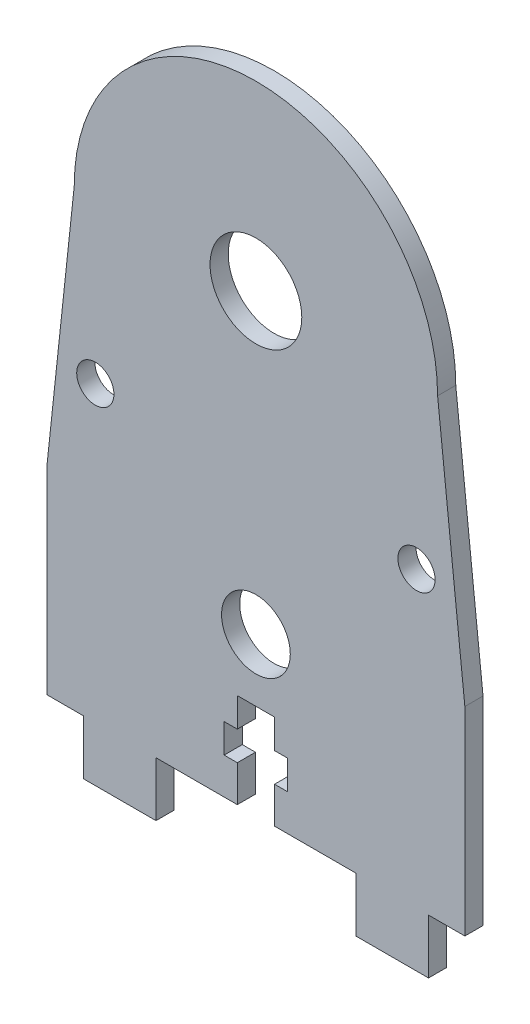
ISO-10303-21;
HEADER;
FILE_DESCRIPTION(('STEP AP214'),'2;1');
FILE_NAME('part.step','',(''),(''),'','','');
FILE_SCHEMA(('AUTOMOTIVE_DESIGN { 1 0 10303 214 1 1 1 1 }'));
ENDSEC;
DATA;
#1=APPLICATION_CONTEXT('core data for automotive mechanical design processes');
#2=APPLICATION_PROTOCOL_DEFINITION('international standard','automotive_design',2000,#1);
#3=PRODUCT_CONTEXT('',#1,'mechanical');
#4=PRODUCT('Part','Part','',(#3));
#5=PRODUCT_RELATED_PRODUCT_CATEGORY('part','',(#4));
#6=PRODUCT_DEFINITION_FORMATION('','',#4);
#7=PRODUCT_DEFINITION_CONTEXT('part definition',#1,'design');
#8=PRODUCT_DEFINITION('design','',#6,#7);
#9=PRODUCT_DEFINITION_SHAPE('','',#8);
#10=(LENGTH_UNIT() NAMED_UNIT(*) SI_UNIT(.MILLI.,.METRE.));
#11=(NAMED_UNIT(*) PLANE_ANGLE_UNIT() SI_UNIT($,.RADIAN.));
#12=(NAMED_UNIT(*) SI_UNIT($,.STERADIAN.) SOLID_ANGLE_UNIT());
#13=UNCERTAINTY_MEASURE_WITH_UNIT(LENGTH_MEASURE(1.E-05),#10,'distance_accuracy_value','');
#14=(GEOMETRIC_REPRESENTATION_CONTEXT(3) GLOBAL_UNCERTAINTY_ASSIGNED_CONTEXT((#13)) GLOBAL_UNIT_ASSIGNED_CONTEXT((#10,
#11,#12)) REPRESENTATION_CONTEXT('',''));
#15=CARTESIAN_POINT('',(0.,0.,0.));
#16=DIRECTION('',(0.,0.,1.));
#17=DIRECTION('',(1.,0.,0.));
#18=AXIS2_PLACEMENT_3D('',#15,#16,#17);
#19=CARTESIAN_POINT('',(-7.637732912881,70.7362785958988,2.));
#20=DIRECTION('',(0.,0.,1.));
#21=DIRECTION('',(1.,0.,0.));
#22=AXIS2_PLACEMENT_3D('',#19,#20,#21);
#23=PLANE('',#22);
#24=CARTESIAN_POINT('',(-25.3154024425447,53.0586090662352,2.));
#25=DIRECTION('',(0.,0.,1.));
#26=DIRECTION('',(-1.,0.,0.));
#27=AXIS2_PLACEMENT_3D('',#24,#25,#26);
#28=CIRCLE('',#27,2.05);
#29=CARTESIAN_POINT('',(-27.3654024425447,53.0586090662352,2.));
#30=VERTEX_POINT('',#29);
#31=EDGE_CURVE('E475',#30,#30,#28,.T.);
#32=ORIENTED_EDGE('',*,*,#31,.F.);
#33=EDGE_LOOP('',(#32));
#34=FACE_BOUND('',#33,.T.);
#35=CARTESIAN_POINT('',(-7.637732912881,70.7362785958988,2.));
#36=DIRECTION('',(0.,0.,1.));
#37=DIRECTION('',(1.,0.,0.));
#38=AXIS2_PLACEMENT_3D('',#35,#36,#37);
#39=CIRCLE('',#38,5.05);
#40=CARTESIAN_POINT('',(-2.587732912881,70.7362785958988,2.));
#41=VERTEX_POINT('',#40);
#42=EDGE_CURVE('E244',#41,#41,#39,.T.);
#43=ORIENTED_EDGE('',*,*,#42,.F.);
#44=EDGE_LOOP('',(#43));
#45=FACE_BOUND('',#44,.T.);
#46=DIRECTION('',(1.,0.,0.));
#47=VECTOR('',#46,1.);
#48=CARTESIAN_POINT('',(-5.587732912881,20.7362785958988,2.));
#49=LINE('',#48,#47);
#50=CARTESIAN_POINT('',(-5.587732912881,20.7362785958988,2.));
#51=VERTEX_POINT('',#50);
#52=CARTESIAN_POINT('',(3.362267087119,20.7362785958988,2.));
#53=VERTEX_POINT('',#52);
#54=EDGE_CURVE('E291',#51,#53,#49,.T.);
#55=ORIENTED_EDGE('',*,*,#54,.T.);
#56=DIRECTION('',(0.,-1.,0.));
#57=VECTOR('',#56,1.);
#58=CARTESIAN_POINT('',(3.362267087119,20.7362785958988,2.));
#59=LINE('',#58,#57);
#60=CARTESIAN_POINT('',(3.362267087119,14.7362785958988,2.));
#61=VERTEX_POINT('',#60);
#62=EDGE_CURVE('E149',#53,#61,#59,.T.);
#63=ORIENTED_EDGE('',*,*,#62,.T.);
#64=DIRECTION('',(1.,0.,0.));
#65=VECTOR('',#64,1.);
#66=CARTESIAN_POINT('',(3.362267087119,14.7362785958988,2.));
#67=LINE('',#66,#65);
#68=CARTESIAN_POINT('',(11.362267087119,14.7362785958988,2.));
#69=VERTEX_POINT('',#68);
#70=EDGE_CURVE('E360',#61,#69,#67,.T.);
#71=ORIENTED_EDGE('',*,*,#70,.T.);
#72=DIRECTION('',(0.,1.,0.));
#73=VECTOR('',#72,1.);
#74=CARTESIAN_POINT('',(11.362267087119,14.7362785958988,2.));
#75=LINE('',#74,#73);
#76=CARTESIAN_POINT('',(11.362267087119,20.7362785958988,2.));
#77=VERTEX_POINT('',#76);
#78=EDGE_CURVE('E379',#69,#77,#75,.T.);
#79=ORIENTED_EDGE('',*,*,#78,.T.);
#80=DIRECTION('',(1.,0.,0.));
#81=VECTOR('',#80,1.);
#82=CARTESIAN_POINT('',(11.362267087119,20.7362785958988,2.));
#83=LINE('',#82,#81);
#84=CARTESIAN_POINT('',(15.362267087119,20.7362785958988,2.));
#85=VERTEX_POINT('',#84);
#86=EDGE_CURVE('E376',#77,#85,#83,.T.);
#87=ORIENTED_EDGE('',*,*,#86,.T.);
#88=DIRECTION('',(0.,1.,0.));
#89=VECTOR('',#88,1.);
#90=CARTESIAN_POINT('',(15.362267087119,42.6223304703362,2.));
#91=LINE('',#90,#89);
#92=CARTESIAN_POINT('',(15.362267087119,42.6223304703362,2.));
#93=VERTEX_POINT('',#92);
#94=EDGE_CURVE('E378',#85,#93,#91,.T.);
#95=ORIENTED_EDGE('',*,*,#94,.T.);
#96=DIRECTION('',(-0.106106207262717,0.994354802261407,0.));
#97=VECTOR('',#96,1.);
#98=CARTESIAN_POINT('',(15.362267087119,42.6223304703362,2.));
#99=LINE('',#98,#97);
#100=CARTESIAN_POINT('',(12.362267087119,70.7362785958988,2.));
#101=VERTEX_POINT('',#100);
#102=EDGE_CURVE('E381',#93,#101,#99,.T.);
#103=ORIENTED_EDGE('',*,*,#102,.T.);
#104=CARTESIAN_POINT('',(-7.637732912881,70.7362785958988,2.));
#105=DIRECTION('',(0.,0.,1.));
#106=DIRECTION('',(1.,0.,0.));
#107=AXIS2_PLACEMENT_3D('',#104,#105,#106);
#108=CIRCLE('',#107,20.);
#109=CARTESIAN_POINT('',(-27.637732912881,70.7362785958988,2.));
#110=VERTEX_POINT('',#109);
#111=EDGE_CURVE('E387',#101,#110,#108,.T.);
#112=ORIENTED_EDGE('',*,*,#111,.T.);
#113=DIRECTION('',(-0.106106207262717,-0.994354802261407,0.));
#114=VECTOR('',#113,1.);
#115=CARTESIAN_POINT('',(-30.637732912881,42.6223304703362,2.));
#116=LINE('',#115,#114);
#117=CARTESIAN_POINT('',(-30.637732912881,42.6223304703362,2.));
#118=VERTEX_POINT('',#117);
#119=EDGE_CURVE('E389',#110,#118,#116,.T.);
#120=ORIENTED_EDGE('',*,*,#119,.T.);
#121=DIRECTION('',(0.,-1.,0.));
#122=VECTOR('',#121,1.);
#123=CARTESIAN_POINT('',(-30.637732912881,42.6223304703362,2.));
#124=LINE('',#123,#122);
#125=CARTESIAN_POINT('',(-30.637732912881,20.7362785958988,2.));
#126=VERTEX_POINT('',#125);
#127=EDGE_CURVE('E391',#118,#126,#124,.T.);
#128=ORIENTED_EDGE('',*,*,#127,.T.);
#129=DIRECTION('',(1.,0.,0.));
#130=VECTOR('',#129,1.);
#131=CARTESIAN_POINT('',(-26.637732912881,20.7362785958988,2.));
#132=LINE('',#131,#130);
#133=CARTESIAN_POINT('',(-26.637732912881,20.7362785958988,2.));
#134=VERTEX_POINT('',#133);
#135=EDGE_CURVE('E393',#126,#134,#132,.T.);
#136=ORIENTED_EDGE('',*,*,#135,.T.);
#137=DIRECTION('',(0.,-1.,0.));
#138=VECTOR('',#137,1.);
#139=CARTESIAN_POINT('',(-26.637732912881,14.7362785958988,2.));
#140=LINE('',#139,#138);
#141=CARTESIAN_POINT('',(-26.637732912881,14.7362785958988,2.));
#142=VERTEX_POINT('',#141);
#143=EDGE_CURVE('E395',#134,#142,#140,.T.);
#144=ORIENTED_EDGE('',*,*,#143,.T.);
#145=DIRECTION('',(1.,0.,0.));
#146=VECTOR('',#145,1.);
#147=CARTESIAN_POINT('',(-18.637732912881,14.7362785958988,2.));
#148=LINE('',#147,#146);
#149=CARTESIAN_POINT('',(-18.637732912881,14.7362785958988,2.));
#150=VERTEX_POINT('',#149);
#151=EDGE_CURVE('E397',#142,#150,#148,.T.);
#152=ORIENTED_EDGE('',*,*,#151,.T.);
#153=DIRECTION('',(0.,1.,0.));
#154=VECTOR('',#153,1.);
#155=CARTESIAN_POINT('',(-18.637732912881,20.7362785958988,2.));
#156=LINE('',#155,#154);
#157=CARTESIAN_POINT('',(-18.637732912881,20.7362785958988,2.));
#158=VERTEX_POINT('',#157);
#159=EDGE_CURVE('E399',#150,#158,#156,.T.);
#160=ORIENTED_EDGE('',*,*,#159,.T.);
#161=DIRECTION('',(1.,0.,0.));
#162=VECTOR('',#161,1.);
#163=CARTESIAN_POINT('',(-9.687732912881,20.7362785958988,2.));
#164=LINE('',#163,#162);
#165=CARTESIAN_POINT('',(-9.687732912881,20.7362785958988,2.));
#166=VERTEX_POINT('',#165);
#167=EDGE_CURVE('E401',#158,#166,#164,.T.);
#168=ORIENTED_EDGE('',*,*,#167,.T.);
#169=DIRECTION('',(0.,1.,0.));
#170=VECTOR('',#169,1.);
#171=CARTESIAN_POINT('',(-9.687732912881,20.7362785958988,2.));
#172=LINE('',#171,#170);
#173=CARTESIAN_POINT('',(-9.687732912881,24.7362785958988,2.));
#174=VERTEX_POINT('',#173);
#175=EDGE_CURVE('E403',#166,#174,#172,.T.);
#176=ORIENTED_EDGE('',*,*,#175,.T.);
#177=DIRECTION('',(-1.,0.,0.));
#178=VECTOR('',#177,1.);
#179=CARTESIAN_POINT('',(-9.687732912881,24.7362785958988,2.));
#180=LINE('',#179,#178);
#181=CARTESIAN_POINT('',(-11.137732912881,24.7362785958988,2.));
#182=VERTEX_POINT('',#181);
#183=EDGE_CURVE('E405',#174,#182,#180,.T.);
#184=ORIENTED_EDGE('',*,*,#183,.T.);
#185=DIRECTION('',(0.,1.,0.));
#186=VECTOR('',#185,1.);
#187=CARTESIAN_POINT('',(-11.137732912881,24.7362785958988,2.));
#188=LINE('',#187,#186);
#189=CARTESIAN_POINT('',(-11.137732912881,27.9362785958988,2.));
#190=VERTEX_POINT('',#189);
#191=EDGE_CURVE('E407',#182,#190,#188,.T.);
#192=ORIENTED_EDGE('',*,*,#191,.T.);
#193=DIRECTION('',(1.,0.,0.));
#194=VECTOR('',#193,1.);
#195=CARTESIAN_POINT('',(-11.137732912881,27.9362785958988,2.));
#196=LINE('',#195,#194);
#197=CARTESIAN_POINT('',(-9.687732912881,27.9362785958988,2.));
#198=VERTEX_POINT('',#197);
#199=EDGE_CURVE('E409',#190,#198,#196,.T.);
#200=ORIENTED_EDGE('',*,*,#199,.T.);
#201=DIRECTION('',(0.,1.,0.));
#202=VECTOR('',#201,1.);
#203=CARTESIAN_POINT('',(-9.687732912881,27.9362785958988,2.));
#204=LINE('',#203,#202);
#205=CARTESIAN_POINT('',(-9.687732912881,31.1362785958988,2.));
#206=VERTEX_POINT('',#205);
#207=EDGE_CURVE('E411',#198,#206,#204,.T.);
#208=ORIENTED_EDGE('',*,*,#207,.T.);
#209=DIRECTION('',(1.,0.,0.));
#210=VECTOR('',#209,1.);
#211=CARTESIAN_POINT('',(-5.587732912881,31.1362785958988,2.));
#212=LINE('',#211,#210);
#213=CARTESIAN_POINT('',(-5.587732912881,31.1362785958988,2.));
#214=VERTEX_POINT('',#213);
#215=EDGE_CURVE('E413',#206,#214,#212,.T.);
#216=ORIENTED_EDGE('',*,*,#215,.T.);
#217=DIRECTION('',(0.,-1.,0.));
#218=VECTOR('',#217,1.);
#219=CARTESIAN_POINT('',(-5.587732912881,27.9362785958988,2.));
#220=LINE('',#219,#218);
#221=CARTESIAN_POINT('',(-5.587732912881,27.9362785958988,2.));
#222=VERTEX_POINT('',#221);
#223=EDGE_CURVE('E415',#214,#222,#220,.T.);
#224=ORIENTED_EDGE('',*,*,#223,.T.);
#225=DIRECTION('',(1.,0.,0.));
#226=VECTOR('',#225,1.);
#227=CARTESIAN_POINT('',(-4.137732912881,27.9362785958988,2.));
#228=LINE('',#227,#226);
#229=CARTESIAN_POINT('',(-4.137732912881,27.9362785958988,2.));
#230=VERTEX_POINT('',#229);
#231=EDGE_CURVE('E222',#222,#230,#228,.T.);
#232=ORIENTED_EDGE('',*,*,#231,.T.);
#233=DIRECTION('',(0.,-1.,0.));
#234=VECTOR('',#233,1.);
#235=CARTESIAN_POINT('',(-4.137732912881,24.7362785958988,2.));
#236=LINE('',#235,#234);
#237=CARTESIAN_POINT('',(-4.137732912881,24.7362785958988,2.));
#238=VERTEX_POINT('',#237);
#239=EDGE_CURVE('E216',#230,#238,#236,.T.);
#240=ORIENTED_EDGE('',*,*,#239,.T.);
#241=DIRECTION('',(-1.,0.,0.));
#242=VECTOR('',#241,1.);
#243=CARTESIAN_POINT('',(-5.587732912881,24.7362785958988,2.));
#244=LINE('',#243,#242);
#245=CARTESIAN_POINT('',(-5.587732912881,24.7362785958988,2.));
#246=VERTEX_POINT('',#245);
#247=EDGE_CURVE('E220',#238,#246,#244,.T.);
#248=ORIENTED_EDGE('',*,*,#247,.T.);
#249=DIRECTION('',(0.,-1.,0.));
#250=VECTOR('',#249,1.);
#251=CARTESIAN_POINT('',(-5.587732912881,20.7362785958988,2.));
#252=LINE('',#251,#250);
#253=EDGE_CURVE('E52',#246,#51,#252,.T.);
#254=ORIENTED_EDGE('',*,*,#253,.T.);
#255=EDGE_LOOP('',(#55,#63,#71,#79,#87,#95,#103,#112,#120,#128,#136,#144,#152,#160,#168,#176,
#184,#192,#200,#208,#216,#224,#232,#240,#248,#254));
#256=FACE_BOUND('',#255,.T.);
#257=CARTESIAN_POINT('',(10.0399366167827,53.0586090662352,2.));
#258=DIRECTION('',(0.,0.,1.));
#259=DIRECTION('',(1.,0.,0.));
#260=AXIS2_PLACEMENT_3D('',#257,#258,#259);
#261=CIRCLE('',#260,2.05);
#262=CARTESIAN_POINT('',(12.0899366167827,53.0586090662352,2.));
#263=VERTEX_POINT('',#262);
#264=EDGE_CURVE('E481',#263,#263,#261,.T.);
#265=ORIENTED_EDGE('',*,*,#264,.F.);
#266=EDGE_LOOP('',(#265));
#267=FACE_BOUND('',#266,.T.);
#268=CARTESIAN_POINT('',(-7.637732912881,38.004477846556,2.));
#269=DIRECTION('',(0.,0.,1.));
#270=DIRECTION('',(1.,0.,0.));
#271=AXIS2_PLACEMENT_3D('',#268,#269,#270);
#272=CIRCLE('',#271,3.78387623166951);
#273=CARTESIAN_POINT('',(-3.85385668121149,38.004477846556,2.));
#274=VERTEX_POINT('',#273);
#275=EDGE_CURVE('E466',#274,#274,#272,.T.);
#276=ORIENTED_EDGE('',*,*,#275,.F.);
#277=EDGE_LOOP('',(#276));
#278=FACE_BOUND('',#277,.T.);
#279=ADVANCED_FACE('F35',(#34,#45,#256,#267,#278),#23,.T.);
#280=CARTESIAN_POINT('',(-7.637732912881,70.7362785958988,0.));
#281=DIRECTION('',(0.,0.,1.));
#282=DIRECTION('',(1.,0.,0.));
#283=AXIS2_PLACEMENT_3D('',#280,#281,#282);
#284=PLANE('',#283);
#285=DIRECTION('',(1.,0.,0.));
#286=VECTOR('',#285,1.);
#287=CARTESIAN_POINT('',(-5.587732912881,20.7362785958988,0.));
#288=LINE('',#287,#286);
#289=CARTESIAN_POINT('',(-5.587732912881,20.7362785958988,0.));
#290=VERTEX_POINT('',#289);
#291=CARTESIAN_POINT('',(3.362267087119,20.7362785958988,0.));
#292=VERTEX_POINT('',#291);
#293=EDGE_CURVE('E240',#290,#292,#288,.T.);
#294=ORIENTED_EDGE('',*,*,#293,.F.);
#295=DIRECTION('',(0.,-1.,0.));
#296=VECTOR('',#295,1.);
#297=CARTESIAN_POINT('',(-5.587732912881,20.7362785958988,0.));
#298=LINE('',#297,#296);
#299=CARTESIAN_POINT('',(-5.587732912881,24.7362785958988,0.));
#300=VERTEX_POINT('',#299);
#301=EDGE_CURVE('E141',#300,#290,#298,.T.);
#302=ORIENTED_EDGE('',*,*,#301,.F.);
#303=DIRECTION('',(-1.,0.,0.));
#304=VECTOR('',#303,1.);
#305=CARTESIAN_POINT('',(-5.587732912881,24.7362785958988,0.));
#306=LINE('',#305,#304);
#307=CARTESIAN_POINT('',(-4.137732912881,24.7362785958988,0.));
#308=VERTEX_POINT('',#307);
#309=EDGE_CURVE('E135',#308,#300,#306,.T.);
#310=ORIENTED_EDGE('',*,*,#309,.F.);
#311=DIRECTION('',(0.,-1.,0.));
#312=VECTOR('',#311,1.);
#313=CARTESIAN_POINT('',(-4.137732912881,24.7362785958988,0.));
#314=LINE('',#313,#312);
#315=CARTESIAN_POINT('',(-4.137732912881,27.9362785958988,0.));
#316=VERTEX_POINT('',#315);
#317=EDGE_CURVE('E230',#316,#308,#314,.T.);
#318=ORIENTED_EDGE('',*,*,#317,.F.);
#319=DIRECTION('',(1.,0.,0.));
#320=VECTOR('',#319,1.);
#321=CARTESIAN_POINT('',(-4.137732912881,27.9362785958988,0.));
#322=LINE('',#321,#320);
#323=CARTESIAN_POINT('',(-5.587732912881,27.9362785958988,0.));
#324=VERTEX_POINT('',#323);
#325=EDGE_CURVE('E286',#324,#316,#322,.T.);
#326=ORIENTED_EDGE('',*,*,#325,.F.);
#327=DIRECTION('',(0.,-1.,0.));
#328=VECTOR('',#327,1.);
#329=CARTESIAN_POINT('',(-5.587732912881,27.9362785958988,0.));
#330=LINE('',#329,#328);
#331=CARTESIAN_POINT('',(-5.587732912881,31.1362785958988,0.));
#332=VERTEX_POINT('',#331);
#333=EDGE_CURVE('E284',#332,#324,#330,.T.);
#334=ORIENTED_EDGE('',*,*,#333,.F.);
#335=DIRECTION('',(1.,0.,0.));
#336=VECTOR('',#335,1.);
#337=CARTESIAN_POINT('',(-5.587732912881,31.1362785958988,0.));
#338=LINE('',#337,#336);
#339=CARTESIAN_POINT('',(-9.687732912881,31.1362785958988,0.));
#340=VERTEX_POINT('',#339);
#341=EDGE_CURVE('E282',#340,#332,#338,.T.);
#342=ORIENTED_EDGE('',*,*,#341,.F.);
#343=DIRECTION('',(0.,1.,0.));
#344=VECTOR('',#343,1.);
#345=CARTESIAN_POINT('',(-9.687732912881,27.9362785958988,0.));
#346=LINE('',#345,#344);
#347=CARTESIAN_POINT('',(-9.687732912881,27.9362785958988,0.));
#348=VERTEX_POINT('',#347);
#349=EDGE_CURVE('E280',#348,#340,#346,.T.);
#350=ORIENTED_EDGE('',*,*,#349,.F.);
#351=DIRECTION('',(1.,0.,0.));
#352=VECTOR('',#351,1.);
#353=CARTESIAN_POINT('',(-11.137732912881,27.9362785958988,0.));
#354=LINE('',#353,#352);
#355=CARTESIAN_POINT('',(-11.137732912881,27.9362785958988,0.));
#356=VERTEX_POINT('',#355);
#357=EDGE_CURVE('E278',#356,#348,#354,.T.);
#358=ORIENTED_EDGE('',*,*,#357,.F.);
#359=DIRECTION('',(0.,1.,0.));
#360=VECTOR('',#359,1.);
#361=CARTESIAN_POINT('',(-11.137732912881,24.7362785958988,0.));
#362=LINE('',#361,#360);
#363=CARTESIAN_POINT('',(-11.137732912881,24.7362785958988,0.));
#364=VERTEX_POINT('',#363);
#365=EDGE_CURVE('E276',#364,#356,#362,.T.);
#366=ORIENTED_EDGE('',*,*,#365,.F.);
#367=DIRECTION('',(-1.,0.,0.));
#368=VECTOR('',#367,1.);
#369=CARTESIAN_POINT('',(-9.687732912881,24.7362785958988,0.));
#370=LINE('',#369,#368);
#371=CARTESIAN_POINT('',(-9.687732912881,24.7362785958988,0.));
#372=VERTEX_POINT('',#371);
#373=EDGE_CURVE('E274',#372,#364,#370,.T.);
#374=ORIENTED_EDGE('',*,*,#373,.F.);
#375=DIRECTION('',(0.,1.,0.));
#376=VECTOR('',#375,1.);
#377=CARTESIAN_POINT('',(-9.687732912881,20.7362785958988,0.));
#378=LINE('',#377,#376);
#379=CARTESIAN_POINT('',(-9.687732912881,20.7362785958988,0.));
#380=VERTEX_POINT('',#379);
#381=EDGE_CURVE('E272',#380,#372,#378,.T.);
#382=ORIENTED_EDGE('',*,*,#381,.F.);
#383=DIRECTION('',(1.,0.,0.));
#384=VECTOR('',#383,1.);
#385=CARTESIAN_POINT('',(-9.687732912881,20.7362785958988,0.));
#386=LINE('',#385,#384);
#387=CARTESIAN_POINT('',(-18.637732912881,20.7362785958988,0.));
#388=VERTEX_POINT('',#387);
#389=EDGE_CURVE('E270',#388,#380,#386,.T.);
#390=ORIENTED_EDGE('',*,*,#389,.F.);
#391=DIRECTION('',(0.,1.,0.));
#392=VECTOR('',#391,1.);
#393=CARTESIAN_POINT('',(-18.637732912881,20.7362785958988,0.));
#394=LINE('',#393,#392);
#395=CARTESIAN_POINT('',(-18.637732912881,14.7362785958988,0.));
#396=VERTEX_POINT('',#395);
#397=EDGE_CURVE('E268',#396,#388,#394,.T.);
#398=ORIENTED_EDGE('',*,*,#397,.F.);
#399=DIRECTION('',(1.,0.,0.));
#400=VECTOR('',#399,1.);
#401=CARTESIAN_POINT('',(-18.637732912881,14.7362785958988,0.));
#402=LINE('',#401,#400);
#403=CARTESIAN_POINT('',(-26.637732912881,14.7362785958988,0.));
#404=VERTEX_POINT('',#403);
#405=EDGE_CURVE('E266',#404,#396,#402,.T.);
#406=ORIENTED_EDGE('',*,*,#405,.F.);
#407=DIRECTION('',(0.,-1.,0.));
#408=VECTOR('',#407,1.);
#409=CARTESIAN_POINT('',(-26.637732912881,14.7362785958988,0.));
#410=LINE('',#409,#408);
#411=CARTESIAN_POINT('',(-26.637732912881,20.7362785958988,0.));
#412=VERTEX_POINT('',#411);
#413=EDGE_CURVE('E264',#412,#404,#410,.T.);
#414=ORIENTED_EDGE('',*,*,#413,.F.);
#415=DIRECTION('',(1.,0.,0.));
#416=VECTOR('',#415,1.);
#417=CARTESIAN_POINT('',(-26.637732912881,20.7362785958988,0.));
#418=LINE('',#417,#416);
#419=CARTESIAN_POINT('',(-30.637732912881,20.7362785958988,0.));
#420=VERTEX_POINT('',#419);
#421=EDGE_CURVE('E262',#420,#412,#418,.T.);
#422=ORIENTED_EDGE('',*,*,#421,.F.);
#423=DIRECTION('',(0.,-1.,0.));
#424=VECTOR('',#423,1.);
#425=CARTESIAN_POINT('',(-30.637732912881,42.6223304703362,0.));
#426=LINE('',#425,#424);
#427=CARTESIAN_POINT('',(-30.637732912881,42.6223304703362,0.));
#428=VERTEX_POINT('',#427);
#429=EDGE_CURVE('E260',#428,#420,#426,.T.);
#430=ORIENTED_EDGE('',*,*,#429,.F.);
#431=DIRECTION('',(-0.106106207262717,-0.994354802261407,0.));
#432=VECTOR('',#431,1.);
#433=CARTESIAN_POINT('',(-30.637732912881,42.6223304703362,0.));
#434=LINE('',#433,#432);
#435=CARTESIAN_POINT('',(-27.637732912881,70.7362785958988,0.));
#436=VERTEX_POINT('',#435);
#437=EDGE_CURVE('E258',#436,#428,#434,.T.);
#438=ORIENTED_EDGE('',*,*,#437,.F.);
#439=CARTESIAN_POINT('',(-7.637732912881,70.7362785958988,0.));
#440=DIRECTION('',(0.,0.,1.));
#441=DIRECTION('',(1.,0.,0.));
#442=AXIS2_PLACEMENT_3D('',#439,#440,#441);
#443=CIRCLE('',#442,20.);
#444=CARTESIAN_POINT('',(12.362267087119,70.7362785958988,0.));
#445=VERTEX_POINT('',#444);
#446=EDGE_CURVE('E256',#445,#436,#443,.T.);
#447=ORIENTED_EDGE('',*,*,#446,.F.);
#448=DIRECTION('',(-0.106106207262717,0.994354802261407,0.));
#449=VECTOR('',#448,1.);
#450=CARTESIAN_POINT('',(15.362267087119,42.6223304703362,0.));
#451=LINE('',#450,#449);
#452=CARTESIAN_POINT('',(15.362267087119,42.6223304703362,0.));
#453=VERTEX_POINT('',#452);
#454=EDGE_CURVE('E254',#453,#445,#451,.T.);
#455=ORIENTED_EDGE('',*,*,#454,.F.);
#456=DIRECTION('',(0.,1.,0.));
#457=VECTOR('',#456,1.);
#458=CARTESIAN_POINT('',(15.362267087119,42.6223304703362,0.));
#459=LINE('',#458,#457);
#460=CARTESIAN_POINT('',(15.362267087119,20.7362785958988,0.));
#461=VERTEX_POINT('',#460);
#462=EDGE_CURVE('E252',#461,#453,#459,.T.);
#463=ORIENTED_EDGE('',*,*,#462,.F.);
#464=DIRECTION('',(1.,0.,0.));
#465=VECTOR('',#464,1.);
#466=CARTESIAN_POINT('',(11.362267087119,20.7362785958988,0.));
#467=LINE('',#466,#465);
#468=CARTESIAN_POINT('',(11.362267087119,20.7362785958988,0.));
#469=VERTEX_POINT('',#468);
#470=EDGE_CURVE('E250',#469,#461,#467,.T.);
#471=ORIENTED_EDGE('',*,*,#470,.F.);
#472=DIRECTION('',(0.,1.,0.));
#473=VECTOR('',#472,1.);
#474=CARTESIAN_POINT('',(11.362267087119,14.7362785958988,0.));
#475=LINE('',#474,#473);
#476=CARTESIAN_POINT('',(11.362267087119,14.7362785958988,0.));
#477=VERTEX_POINT('',#476);
#478=EDGE_CURVE('E248',#477,#469,#475,.T.);
#479=ORIENTED_EDGE('',*,*,#478,.F.);
#480=DIRECTION('',(1.,0.,0.));
#481=VECTOR('',#480,1.);
#482=CARTESIAN_POINT('',(3.362267087119,14.7362785958988,0.));
#483=LINE('',#482,#481);
#484=CARTESIAN_POINT('',(3.362267087119,14.7362785958988,0.));
#485=VERTEX_POINT('',#484);
#486=EDGE_CURVE('E246',#485,#477,#483,.T.);
#487=ORIENTED_EDGE('',*,*,#486,.F.);
#488=DIRECTION('',(0.,-1.,0.));
#489=VECTOR('',#488,1.);
#490=CARTESIAN_POINT('',(3.362267087119,20.7362785958988,0.));
#491=LINE('',#490,#489);
#492=EDGE_CURVE('E243',#292,#485,#491,.T.);
#493=ORIENTED_EDGE('',*,*,#492,.F.);
#494=EDGE_LOOP('',(#294,#302,#310,#318,#326,#334,#342,#350,#358,#366,#374,#382,#390,#398,#406,
#414,#422,#430,#438,#447,#455,#463,#471,#479,#487,#493));
#495=FACE_BOUND('',#494,.T.);
#496=CARTESIAN_POINT('',(-7.637732912881,70.7362785958988,0.));
#497=DIRECTION('',(0.,0.,1.));
#498=DIRECTION('',(1.,0.,0.));
#499=AXIS2_PLACEMENT_3D('',#496,#497,#498);
#500=CIRCLE('',#499,5.05);
#501=CARTESIAN_POINT('',(-2.587732912881,70.7362785958988,0.));
#502=VERTEX_POINT('',#501);
#503=EDGE_CURVE('E484',#502,#502,#500,.T.);
#504=ORIENTED_EDGE('',*,*,#503,.T.);
#505=EDGE_LOOP('',(#504));
#506=FACE_BOUND('',#505,.T.);
#507=CARTESIAN_POINT('',(10.0399366167827,53.0586090662352,0.));
#508=DIRECTION('',(0.,0.,1.));
#509=DIRECTION('',(1.,0.,0.));
#510=AXIS2_PLACEMENT_3D('',#507,#508,#509);
#511=CIRCLE('',#510,2.05);
#512=CARTESIAN_POINT('',(12.0899366167827,53.0586090662352,0.));
#513=VERTEX_POINT('',#512);
#514=EDGE_CURVE('E478',#513,#513,#511,.T.);
#515=ORIENTED_EDGE('',*,*,#514,.T.);
#516=EDGE_LOOP('',(#515));
#517=FACE_BOUND('',#516,.T.);
#518=CARTESIAN_POINT('',(-25.3154024425447,53.0586090662352,0.));
#519=DIRECTION('',(0.,0.,1.));
#520=DIRECTION('',(-1.,0.,0.));
#521=AXIS2_PLACEMENT_3D('',#518,#519,#520);
#522=CIRCLE('',#521,2.05);
#523=CARTESIAN_POINT('',(-27.3654024425447,53.0586090662352,0.));
#524=VERTEX_POINT('',#523);
#525=EDGE_CURVE('E472',#524,#524,#522,.T.);
#526=ORIENTED_EDGE('',*,*,#525,.T.);
#527=EDGE_LOOP('',(#526));
#528=FACE_BOUND('',#527,.T.);
#529=CARTESIAN_POINT('',(-7.637732912881,38.004477846556,0.));
#530=DIRECTION('',(0.,0.,1.));
#531=DIRECTION('',(1.,0.,0.));
#532=AXIS2_PLACEMENT_3D('',#529,#530,#531);
#533=CIRCLE('',#532,3.78387623166951);
#534=CARTESIAN_POINT('',(-3.85385668121149,38.004477846556,0.));
#535=VERTEX_POINT('',#534);
#536=EDGE_CURVE('E469',#535,#535,#533,.T.);
#537=ORIENTED_EDGE('',*,*,#536,.T.);
#538=EDGE_LOOP('',(#537));
#539=FACE_BOUND('',#538,.T.);
#540=ADVANCED_FACE('F364',(#495,#506,#517,#528,#539),#284,.F.);
#541=CARTESIAN_POINT('',(-5.587732912881,20.7362785958988,2.));
#542=DIRECTION('',(0.,1.,0.));
#543=DIRECTION('',(0.,0.,1.));
#544=AXIS2_PLACEMENT_3D('',#541,#542,#543);
#545=PLANE('',#544);
#546=ORIENTED_EDGE('',*,*,#293,.T.);
#547=DIRECTION('',(0.,0.,-1.));
#548=VECTOR('',#547,1.);
#549=CARTESIAN_POINT('',(3.362267087119,20.7362785958988,2.));
#550=LINE('',#549,#548);
#551=EDGE_CURVE('E11',#53,#292,#550,.T.);
#552=ORIENTED_EDGE('',*,*,#551,.F.);
#553=ORIENTED_EDGE('',*,*,#54,.F.);
#554=DIRECTION('',(0.,0.,-1.));
#555=VECTOR('',#554,1.);
#556=CARTESIAN_POINT('',(-5.587732912881,20.7362785958988,2.));
#557=LINE('',#556,#555);
#558=EDGE_CURVE('E236',#51,#290,#557,.T.);
#559=ORIENTED_EDGE('',*,*,#558,.T.);
#560=EDGE_LOOP('',(#546,#552,#553,#559));
#561=FACE_BOUND('',#560,.T.);
#562=ADVANCED_FACE('F37',(#561),#545,.F.);
#563=CARTESIAN_POINT('',(3.362267087119,20.7362785958988,2.));
#564=DIRECTION('',(1.,0.,0.));
#565=DIRECTION('',(0.,1.,0.));
#566=AXIS2_PLACEMENT_3D('',#563,#564,#565);
#567=PLANE('',#566);
#568=ORIENTED_EDGE('',*,*,#492,.T.);
#569=DIRECTION('',(0.,0.,-1.));
#570=VECTOR('',#569,1.);
#571=CARTESIAN_POINT('',(3.362267087119,14.7362785958988,2.));
#572=LINE('',#571,#570);
#573=EDGE_CURVE('E44',#61,#485,#572,.T.);
#574=ORIENTED_EDGE('',*,*,#573,.F.);
#575=ORIENTED_EDGE('',*,*,#62,.F.);
#576=ORIENTED_EDGE('',*,*,#551,.T.);
#577=EDGE_LOOP('',(#568,#574,#575,#576));
#578=FACE_BOUND('',#577,.T.);
#579=ADVANCED_FACE('F734',(#578),#567,.F.);
#580=CARTESIAN_POINT('',(3.362267087119,14.7362785958988,2.));
#581=DIRECTION('',(0.,1.,0.));
#582=DIRECTION('',(0.,0.,1.));
#583=AXIS2_PLACEMENT_3D('',#580,#581,#582);
#584=PLANE('',#583);
#585=ORIENTED_EDGE('',*,*,#486,.T.);
#586=DIRECTION('',(0.,0.,-1.));
#587=VECTOR('',#586,1.);
#588=CARTESIAN_POINT('',(11.362267087119,14.7362785958988,2.));
#589=LINE('',#588,#587);
#590=EDGE_CURVE('E352',#69,#477,#589,.T.);
#591=ORIENTED_EDGE('',*,*,#590,.F.);
#592=ORIENTED_EDGE('',*,*,#70,.F.);
#593=ORIENTED_EDGE('',*,*,#573,.T.);
#594=EDGE_LOOP('',(#585,#591,#592,#593));
#595=FACE_BOUND('',#594,.T.);
#596=ADVANCED_FACE('F358',(#595),#584,.F.);
#597=CARTESIAN_POINT('',(11.362267087119,14.7362785958988,2.));
#598=DIRECTION('',(-1.,0.,0.));
#599=DIRECTION('',(0.,-1.,0.));
#600=AXIS2_PLACEMENT_3D('',#597,#598,#599);
#601=PLANE('',#600);
#602=ORIENTED_EDGE('',*,*,#478,.T.);
#603=DIRECTION('',(0.,0.,-1.));
#604=VECTOR('',#603,1.);
#605=CARTESIAN_POINT('',(11.362267087119,20.7362785958988,2.));
#606=LINE('',#605,#604);
#607=EDGE_CURVE('E349',#77,#469,#606,.T.);
#608=ORIENTED_EDGE('',*,*,#607,.F.);
#609=ORIENTED_EDGE('',*,*,#78,.F.);
#610=ORIENTED_EDGE('',*,*,#590,.T.);
#611=EDGE_LOOP('',(#602,#608,#609,#610));
#612=FACE_BOUND('',#611,.T.);
#613=ADVANCED_FACE('F370',(#612),#601,.F.);
#614=CARTESIAN_POINT('',(11.362267087119,20.7362785958988,2.));
#615=DIRECTION('',(0.,1.,0.));
#616=DIRECTION('',(-1.,0.,0.));
#617=AXIS2_PLACEMENT_3D('',#614,#615,#616);
#618=PLANE('',#617);
#619=ORIENTED_EDGE('',*,*,#470,.T.);
#620=DIRECTION('',(0.,0.,-1.));
#621=VECTOR('',#620,1.);
#622=CARTESIAN_POINT('',(15.362267087119,20.7362785958988,2.));
#623=LINE('',#622,#621);
#624=EDGE_CURVE('E346',#85,#461,#623,.T.);
#625=ORIENTED_EDGE('',*,*,#624,.F.);
#626=ORIENTED_EDGE('',*,*,#86,.F.);
#627=ORIENTED_EDGE('',*,*,#607,.T.);
#628=EDGE_LOOP('',(#619,#625,#626,#627));
#629=FACE_BOUND('',#628,.T.);
#630=ADVANCED_FACE('F374',(#629),#618,.F.);
#631=CARTESIAN_POINT('',(15.362267087119,42.6223304703362,2.));
#632=DIRECTION('',(-1.,0.,0.));
#633=DIRECTION('',(0.,-1.,0.));
#634=AXIS2_PLACEMENT_3D('',#631,#632,#633);
#635=PLANE('',#634);
#636=ORIENTED_EDGE('',*,*,#462,.T.);
#637=DIRECTION('',(0.,0.,-1.));
#638=VECTOR('',#637,1.);
#639=CARTESIAN_POINT('',(15.362267087119,42.6223304703362,2.));
#640=LINE('',#639,#638);
#641=EDGE_CURVE('E343',#93,#453,#640,.T.);
#642=ORIENTED_EDGE('',*,*,#641,.F.);
#643=ORIENTED_EDGE('',*,*,#94,.F.);
#644=ORIENTED_EDGE('',*,*,#624,.T.);
#645=EDGE_LOOP('',(#636,#642,#643,#644));
#646=FACE_BOUND('',#645,.T.);
#647=ADVANCED_FACE('F699',(#646),#635,.F.);
#648=CARTESIAN_POINT('',(15.362267087119,42.6223304703362,2.));
#649=DIRECTION('',(-0.994354802261407,-0.106106207262717,0.));
#650=DIRECTION('',(0.106106207262717,-0.994354802261407,0.));
#651=AXIS2_PLACEMENT_3D('',#648,#649,#650);
#652=PLANE('',#651);
#653=ORIENTED_EDGE('',*,*,#454,.T.);
#654=DIRECTION('',(0.,0.,-1.));
#655=VECTOR('',#654,1.);
#656=CARTESIAN_POINT('',(12.362267087119,70.7362785958988,2.));
#657=LINE('',#656,#655);
#658=EDGE_CURVE('E340',#101,#445,#657,.T.);
#659=ORIENTED_EDGE('',*,*,#658,.F.);
#660=ORIENTED_EDGE('',*,*,#102,.F.);
#661=ORIENTED_EDGE('',*,*,#641,.T.);
#662=EDGE_LOOP('',(#653,#659,#660,#661));
#663=FACE_BOUND('',#662,.T.);
#664=ADVANCED_FACE('F689',(#663),#652,.F.);
#665=CARTESIAN_POINT('',(-7.637732912881,70.7362785958988,2.));
#666=DIRECTION('',(0.,0.,-1.));
#667=DIRECTION('',(-1.,0.,0.));
#668=AXIS2_PLACEMENT_3D('',#665,#666,#667);
#669=CYLINDRICAL_SURFACE('',#668,20.);
#670=ORIENTED_EDGE('',*,*,#446,.T.);
#671=DIRECTION('',(0.,0.,-1.));
#672=VECTOR('',#671,1.);
#673=CARTESIAN_POINT('',(-27.637732912881,70.7362785958988,2.));
#674=LINE('',#673,#672);
#675=EDGE_CURVE('E337',#110,#436,#674,.T.);
#676=ORIENTED_EDGE('',*,*,#675,.F.);
#677=ORIENTED_EDGE('',*,*,#111,.F.);
#678=ORIENTED_EDGE('',*,*,#658,.T.);
#679=EDGE_LOOP('',(#670,#676,#677,#678));
#680=FACE_BOUND('',#679,.T.);
#681=ADVANCED_FACE('F679',(#680),#669,.T.);
#682=CARTESIAN_POINT('',(-30.637732912881,42.6223304703362,2.));
#683=DIRECTION('',(0.994354802261407,-0.106106207262717,0.));
#684=DIRECTION('',(0.106106207262717,0.994354802261407,0.));
#685=AXIS2_PLACEMENT_3D('',#682,#683,#684);
#686=PLANE('',#685);
#687=ORIENTED_EDGE('',*,*,#437,.T.);
#688=DIRECTION('',(0.,0.,-1.));
#689=VECTOR('',#688,1.);
#690=CARTESIAN_POINT('',(-30.637732912881,42.6223304703362,2.));
#691=LINE('',#690,#689);
#692=EDGE_CURVE('E334',#118,#428,#691,.T.);
#693=ORIENTED_EDGE('',*,*,#692,.F.);
#694=ORIENTED_EDGE('',*,*,#119,.F.);
#695=ORIENTED_EDGE('',*,*,#675,.T.);
#696=EDGE_LOOP('',(#687,#693,#694,#695));
#697=FACE_BOUND('',#696,.T.);
#698=ADVANCED_FACE('F669',(#697),#686,.F.);
#699=CARTESIAN_POINT('',(-30.637732912881,42.6223304703362,2.));
#700=DIRECTION('',(1.,0.,0.));
#701=DIRECTION('',(0.,1.,0.));
#702=AXIS2_PLACEMENT_3D('',#699,#700,#701);
#703=PLANE('',#702);
#704=ORIENTED_EDGE('',*,*,#429,.T.);
#705=DIRECTION('',(0.,0.,-1.));
#706=VECTOR('',#705,1.);
#707=CARTESIAN_POINT('',(-30.637732912881,20.7362785958988,2.));
#708=LINE('',#707,#706);
#709=EDGE_CURVE('E331',#126,#420,#708,.T.);
#710=ORIENTED_EDGE('',*,*,#709,.F.);
#711=ORIENTED_EDGE('',*,*,#127,.F.);
#712=ORIENTED_EDGE('',*,*,#692,.T.);
#713=EDGE_LOOP('',(#704,#710,#711,#712));
#714=FACE_BOUND('',#713,.T.);
#715=ADVANCED_FACE('F659',(#714),#703,.F.);
#716=CARTESIAN_POINT('',(-26.637732912881,20.7362785958988,2.));
#717=DIRECTION('',(0.,1.,0.));
#718=DIRECTION('',(-1.,0.,0.));
#719=AXIS2_PLACEMENT_3D('',#716,#717,#718);
#720=PLANE('',#719);
#721=ORIENTED_EDGE('',*,*,#421,.T.);
#722=DIRECTION('',(0.,0.,-1.));
#723=VECTOR('',#722,1.);
#724=CARTESIAN_POINT('',(-26.637732912881,20.7362785958988,2.));
#725=LINE('',#724,#723);
#726=EDGE_CURVE('E328',#134,#412,#725,.T.);
#727=ORIENTED_EDGE('',*,*,#726,.F.);
#728=ORIENTED_EDGE('',*,*,#135,.F.);
#729=ORIENTED_EDGE('',*,*,#709,.T.);
#730=EDGE_LOOP('',(#721,#727,#728,#729));
#731=FACE_BOUND('',#730,.T.);
#732=ADVANCED_FACE('F649',(#731),#720,.F.);
#733=CARTESIAN_POINT('',(-26.637732912881,14.7362785958988,2.));
#734=DIRECTION('',(1.,0.,0.));
#735=DIRECTION('',(0.,0.,-1.));
#736=AXIS2_PLACEMENT_3D('',#733,#734,#735);
#737=PLANE('',#736);
#738=ORIENTED_EDGE('',*,*,#413,.T.);
#739=DIRECTION('',(0.,0.,-1.));
#740=VECTOR('',#739,1.);
#741=CARTESIAN_POINT('',(-26.637732912881,14.7362785958988,2.));
#742=LINE('',#741,#740);
#743=EDGE_CURVE('E325',#142,#404,#742,.T.);
#744=ORIENTED_EDGE('',*,*,#743,.F.);
#745=ORIENTED_EDGE('',*,*,#143,.F.);
#746=ORIENTED_EDGE('',*,*,#726,.T.);
#747=EDGE_LOOP('',(#738,#744,#745,#746));
#748=FACE_BOUND('',#747,.T.);
#749=ADVANCED_FACE('F639',(#748),#737,.F.);
#750=CARTESIAN_POINT('',(-18.637732912881,14.7362785958988,2.));
#751=DIRECTION('',(0.,1.,0.));
#752=DIRECTION('',(0.,0.,1.));
#753=AXIS2_PLACEMENT_3D('',#750,#751,#752);
#754=PLANE('',#753);
#755=ORIENTED_EDGE('',*,*,#405,.T.);
#756=DIRECTION('',(0.,0.,-1.));
#757=VECTOR('',#756,1.);
#758=CARTESIAN_POINT('',(-18.637732912881,14.7362785958988,2.));
#759=LINE('',#758,#757);
#760=EDGE_CURVE('E322',#150,#396,#759,.T.);
#761=ORIENTED_EDGE('',*,*,#760,.F.);
#762=ORIENTED_EDGE('',*,*,#151,.F.);
#763=ORIENTED_EDGE('',*,*,#743,.T.);
#764=EDGE_LOOP('',(#755,#761,#762,#763));
#765=FACE_BOUND('',#764,.T.);
#766=ADVANCED_FACE('F629',(#765),#754,.F.);
#767=CARTESIAN_POINT('',(-18.637732912881,20.7362785958988,2.));
#768=DIRECTION('',(-1.,0.,0.));
#769=DIRECTION('',(0.,-1.,0.));
#770=AXIS2_PLACEMENT_3D('',#767,#768,#769);
#771=PLANE('',#770);
#772=ORIENTED_EDGE('',*,*,#397,.T.);
#773=DIRECTION('',(0.,0.,-1.));
#774=VECTOR('',#773,1.);
#775=CARTESIAN_POINT('',(-18.637732912881,20.7362785958988,2.));
#776=LINE('',#775,#774);
#777=EDGE_CURVE('E319',#158,#388,#776,.T.);
#778=ORIENTED_EDGE('',*,*,#777,.F.);
#779=ORIENTED_EDGE('',*,*,#159,.F.);
#780=ORIENTED_EDGE('',*,*,#760,.T.);
#781=EDGE_LOOP('',(#772,#778,#779,#780));
#782=FACE_BOUND('',#781,.T.);
#783=ADVANCED_FACE('F619',(#782),#771,.F.);
#784=CARTESIAN_POINT('',(-9.687732912881,20.7362785958988,2.));
#785=DIRECTION('',(0.,1.,0.));
#786=DIRECTION('',(0.,0.,1.));
#787=AXIS2_PLACEMENT_3D('',#784,#785,#786);
#788=PLANE('',#787);
#789=ORIENTED_EDGE('',*,*,#389,.T.);
#790=DIRECTION('',(0.,0.,-1.));
#791=VECTOR('',#790,1.);
#792=CARTESIAN_POINT('',(-9.687732912881,20.7362785958988,2.));
#793=LINE('',#792,#791);
#794=EDGE_CURVE('E316',#166,#380,#793,.T.);
#795=ORIENTED_EDGE('',*,*,#794,.F.);
#796=ORIENTED_EDGE('',*,*,#167,.F.);
#797=ORIENTED_EDGE('',*,*,#777,.T.);
#798=EDGE_LOOP('',(#789,#795,#796,#797));
#799=FACE_BOUND('',#798,.T.);
#800=ADVANCED_FACE('F609',(#799),#788,.F.);
#801=CARTESIAN_POINT('',(-9.687732912881,20.7362785958988,2.));
#802=DIRECTION('',(-1.,0.,0.));
#803=DIRECTION('',(0.,0.,1.));
#804=AXIS2_PLACEMENT_3D('',#801,#802,#803);
#805=PLANE('',#804);
#806=ORIENTED_EDGE('',*,*,#381,.T.);
#807=DIRECTION('',(0.,0.,-1.));
#808=VECTOR('',#807,1.);
#809=CARTESIAN_POINT('',(-9.687732912881,24.7362785958988,2.));
#810=LINE('',#809,#808);
#811=EDGE_CURVE('E313',#174,#372,#810,.T.);
#812=ORIENTED_EDGE('',*,*,#811,.F.);
#813=ORIENTED_EDGE('',*,*,#175,.F.);
#814=ORIENTED_EDGE('',*,*,#794,.T.);
#815=EDGE_LOOP('',(#806,#812,#813,#814));
#816=FACE_BOUND('',#815,.T.);
#817=ADVANCED_FACE('F599',(#816),#805,.F.);
#818=CARTESIAN_POINT('',(-9.687732912881,24.7362785958988,2.));
#819=DIRECTION('',(0.,-1.,0.));
#820=DIRECTION('',(0.,0.,-1.));
#821=AXIS2_PLACEMENT_3D('',#818,#819,#820);
#822=PLANE('',#821);
#823=ORIENTED_EDGE('',*,*,#373,.T.);
#824=DIRECTION('',(0.,0.,-1.));
#825=VECTOR('',#824,1.);
#826=CARTESIAN_POINT('',(-11.137732912881,24.7362785958988,2.));
#827=LINE('',#826,#825);
#828=EDGE_CURVE('E310',#182,#364,#827,.T.);
#829=ORIENTED_EDGE('',*,*,#828,.F.);
#830=ORIENTED_EDGE('',*,*,#183,.F.);
#831=ORIENTED_EDGE('',*,*,#811,.T.);
#832=EDGE_LOOP('',(#823,#829,#830,#831));
#833=FACE_BOUND('',#832,.T.);
#834=ADVANCED_FACE('F589',(#833),#822,.F.);
#835=CARTESIAN_POINT('',(-11.137732912881,24.7362785958988,2.));
#836=DIRECTION('',(-1.,0.,0.));
#837=DIRECTION('',(0.,0.,1.));
#838=AXIS2_PLACEMENT_3D('',#835,#836,#837);
#839=PLANE('',#838);
#840=ORIENTED_EDGE('',*,*,#365,.T.);
#841=DIRECTION('',(0.,0.,-1.));
#842=VECTOR('',#841,1.);
#843=CARTESIAN_POINT('',(-11.137732912881,27.9362785958988,2.));
#844=LINE('',#843,#842);
#845=EDGE_CURVE('E307',#190,#356,#844,.T.);
#846=ORIENTED_EDGE('',*,*,#845,.F.);
#847=ORIENTED_EDGE('',*,*,#191,.F.);
#848=ORIENTED_EDGE('',*,*,#828,.T.);
#849=EDGE_LOOP('',(#840,#846,#847,#848));
#850=FACE_BOUND('',#849,.T.);
#851=ADVANCED_FACE('F579',(#850),#839,.F.);
#852=CARTESIAN_POINT('',(-11.137732912881,27.9362785958988,2.));
#853=DIRECTION('',(0.,1.,0.));
#854=DIRECTION('',(0.,0.,1.));
#855=AXIS2_PLACEMENT_3D('',#852,#853,#854);
#856=PLANE('',#855);
#857=ORIENTED_EDGE('',*,*,#357,.T.);
#858=DIRECTION('',(0.,0.,-1.));
#859=VECTOR('',#858,1.);
#860=CARTESIAN_POINT('',(-9.687732912881,27.9362785958988,2.));
#861=LINE('',#860,#859);
#862=EDGE_CURVE('E304',#198,#348,#861,.T.);
#863=ORIENTED_EDGE('',*,*,#862,.F.);
#864=ORIENTED_EDGE('',*,*,#199,.F.);
#865=ORIENTED_EDGE('',*,*,#845,.T.);
#866=EDGE_LOOP('',(#857,#863,#864,#865));
#867=FACE_BOUND('',#866,.T.);
#868=ADVANCED_FACE('F569',(#867),#856,.F.);
#869=CARTESIAN_POINT('',(-9.687732912881,27.9362785958988,2.));
#870=DIRECTION('',(-1.,0.,0.));
#871=DIRECTION('',(0.,0.,1.));
#872=AXIS2_PLACEMENT_3D('',#869,#870,#871);
#873=PLANE('',#872);
#874=ORIENTED_EDGE('',*,*,#349,.T.);
#875=DIRECTION('',(0.,0.,-1.));
#876=VECTOR('',#875,1.);
#877=CARTESIAN_POINT('',(-9.687732912881,31.1362785958988,2.));
#878=LINE('',#877,#876);
#879=EDGE_CURVE('E301',#206,#340,#878,.T.);
#880=ORIENTED_EDGE('',*,*,#879,.F.);
#881=ORIENTED_EDGE('',*,*,#207,.F.);
#882=ORIENTED_EDGE('',*,*,#862,.T.);
#883=EDGE_LOOP('',(#874,#880,#881,#882));
#884=FACE_BOUND('',#883,.T.);
#885=ADVANCED_FACE('F559',(#884),#873,.F.);
#886=CARTESIAN_POINT('',(-5.587732912881,31.1362785958988,2.));
#887=DIRECTION('',(0.,1.,0.));
#888=DIRECTION('',(0.,0.,1.));
#889=AXIS2_PLACEMENT_3D('',#886,#887,#888);
#890=PLANE('',#889);
#891=ORIENTED_EDGE('',*,*,#341,.T.);
#892=DIRECTION('',(0.,0.,-1.));
#893=VECTOR('',#892,1.);
#894=CARTESIAN_POINT('',(-5.587732912881,31.1362785958988,2.));
#895=LINE('',#894,#893);
#896=EDGE_CURVE('E298',#214,#332,#895,.T.);
#897=ORIENTED_EDGE('',*,*,#896,.F.);
#898=ORIENTED_EDGE('',*,*,#215,.F.);
#899=ORIENTED_EDGE('',*,*,#879,.T.);
#900=EDGE_LOOP('',(#891,#897,#898,#899));
#901=FACE_BOUND('',#900,.T.);
#902=ADVANCED_FACE('F550',(#901),#890,.F.);
#903=CARTESIAN_POINT('',(-5.587732912881,27.9362785958988,2.));
#904=DIRECTION('',(1.,0.,0.));
#905=DIRECTION('',(0.,1.,0.));
#906=AXIS2_PLACEMENT_3D('',#903,#904,#905);
#907=PLANE('',#906);
#908=ORIENTED_EDGE('',*,*,#333,.T.);
#909=DIRECTION('',(0.,0.,-1.));
#910=VECTOR('',#909,1.);
#911=CARTESIAN_POINT('',(-5.587732912881,27.9362785958988,2.));
#912=LINE('',#911,#910);
#913=EDGE_CURVE('E295',#222,#324,#912,.T.);
#914=ORIENTED_EDGE('',*,*,#913,.F.);
#915=ORIENTED_EDGE('',*,*,#223,.F.);
#916=ORIENTED_EDGE('',*,*,#896,.T.);
#917=EDGE_LOOP('',(#908,#914,#915,#916));
#918=FACE_BOUND('',#917,.T.);
#919=ADVANCED_FACE('F421',(#918),#907,.F.);
#920=CARTESIAN_POINT('',(-4.137732912881,27.9362785958988,2.));
#921=DIRECTION('',(0.,1.,0.));
#922=DIRECTION('',(0.,0.,1.));
#923=AXIS2_PLACEMENT_3D('',#920,#921,#922);
#924=PLANE('',#923);
#925=ORIENTED_EDGE('',*,*,#325,.T.);
#926=DIRECTION('',(0.,0.,-1.));
#927=VECTOR('',#926,1.);
#928=CARTESIAN_POINT('',(-4.137732912881,27.9362785958988,2.));
#929=LINE('',#928,#927);
#930=EDGE_CURVE('E231',#230,#316,#929,.T.);
#931=ORIENTED_EDGE('',*,*,#930,.F.);
#932=ORIENTED_EDGE('',*,*,#231,.F.);
#933=ORIENTED_EDGE('',*,*,#913,.T.);
#934=EDGE_LOOP('',(#925,#931,#932,#933));
#935=FACE_BOUND('',#934,.T.);
#936=ADVANCED_FACE('F425',(#935),#924,.F.);
#937=CARTESIAN_POINT('',(-4.137732912881,24.7362785958988,2.));
#938=DIRECTION('',(1.,0.,0.));
#939=DIRECTION('',(0.,0.,-1.));
#940=AXIS2_PLACEMENT_3D('',#937,#938,#939);
#941=PLANE('',#940);
#942=ORIENTED_EDGE('',*,*,#317,.T.);
#943=DIRECTION('',(0.,0.,-1.));
#944=VECTOR('',#943,1.);
#945=CARTESIAN_POINT('',(-4.137732912881,24.7362785958988,2.));
#946=LINE('',#945,#944);
#947=EDGE_CURVE('E227',#238,#308,#946,.T.);
#948=ORIENTED_EDGE('',*,*,#947,.F.);
#949=ORIENTED_EDGE('',*,*,#239,.F.);
#950=ORIENTED_EDGE('',*,*,#930,.T.);
#951=EDGE_LOOP('',(#942,#948,#949,#950));
#952=FACE_BOUND('',#951,.T.);
#953=ADVANCED_FACE('F228',(#952),#941,.F.);
#954=CARTESIAN_POINT('',(-5.587732912881,24.7362785958988,2.));
#955=DIRECTION('',(0.,-1.,0.));
#956=DIRECTION('',(0.,0.,-1.));
#957=AXIS2_PLACEMENT_3D('',#954,#955,#956);
#958=PLANE('',#957);
#959=ORIENTED_EDGE('',*,*,#309,.T.);
#960=DIRECTION('',(0.,0.,-1.));
#961=VECTOR('',#960,1.);
#962=CARTESIAN_POINT('',(-5.587732912881,24.7362785958988,2.));
#963=LINE('',#962,#961);
#964=EDGE_CURVE('E232',#246,#300,#963,.T.);
#965=ORIENTED_EDGE('',*,*,#964,.F.);
#966=ORIENTED_EDGE('',*,*,#247,.F.);
#967=ORIENTED_EDGE('',*,*,#947,.T.);
#968=EDGE_LOOP('',(#959,#965,#966,#967));
#969=FACE_BOUND('',#968,.T.);
#970=ADVANCED_FACE('F234',(#969),#958,.F.);
#971=CARTESIAN_POINT('',(-5.587732912881,20.7362785958988,2.));
#972=DIRECTION('',(1.,0.,0.));
#973=DIRECTION('',(0.,0.,-1.));
#974=AXIS2_PLACEMENT_3D('',#971,#972,#973);
#975=PLANE('',#974);
#976=ORIENTED_EDGE('',*,*,#301,.T.);
#977=ORIENTED_EDGE('',*,*,#558,.F.);
#978=ORIENTED_EDGE('',*,*,#253,.F.);
#979=ORIENTED_EDGE('',*,*,#964,.T.);
#980=EDGE_LOOP('',(#976,#977,#978,#979));
#981=FACE_BOUND('',#980,.T.);
#982=ADVANCED_FACE('F429',(#981),#975,.F.);
#983=CARTESIAN_POINT('',(-7.637732912881,70.7362785958988,2.));
#984=DIRECTION('',(0.,0.,-1.));
#985=DIRECTION('',(-1.,0.,0.));
#986=AXIS2_PLACEMENT_3D('',#983,#984,#985);
#987=CYLINDRICAL_SURFACE('',#986,5.05);
#988=ORIENTED_EDGE('',*,*,#42,.T.);
#989=EDGE_LOOP('',(#988));
#990=FACE_BOUND('',#989,.T.);
#991=ORIENTED_EDGE('',*,*,#503,.F.);
#992=EDGE_LOOP('',(#991));
#993=FACE_BOUND('',#992,.T.);
#994=ADVANCED_FACE('F431',(#990,#993),#987,.F.);
#995=CARTESIAN_POINT('',(10.0399366167827,53.0586090662352,2.));
#996=DIRECTION('',(0.,0.,-1.));
#997=DIRECTION('',(-1.,0.,0.));
#998=AXIS2_PLACEMENT_3D('',#995,#996,#997);
#999=CYLINDRICAL_SURFACE('',#998,2.05);
#1000=ORIENTED_EDGE('',*,*,#264,.T.);
#1001=EDGE_LOOP('',(#1000));
#1002=FACE_BOUND('',#1001,.T.);
#1003=ORIENTED_EDGE('',*,*,#514,.F.);
#1004=EDGE_LOOP('',(#1003));
#1005=FACE_BOUND('',#1004,.T.);
#1006=ADVANCED_FACE('F437',(#1002,#1005),#999,.F.);
#1007=CARTESIAN_POINT('',(-25.3154024425447,53.0586090662352,2.));
#1008=DIRECTION('',(0.,0.,-1.));
#1009=DIRECTION('',(-1.,0.,0.));
#1010=AXIS2_PLACEMENT_3D('',#1007,#1008,#1009);
#1011=CYLINDRICAL_SURFACE('',#1010,2.05);
#1012=ORIENTED_EDGE('',*,*,#31,.T.);
#1013=EDGE_LOOP('',(#1012));
#1014=FACE_BOUND('',#1013,.T.);
#1015=ORIENTED_EDGE('',*,*,#525,.F.);
#1016=EDGE_LOOP('',(#1015));
#1017=FACE_BOUND('',#1016,.T.);
#1018=ADVANCED_FACE('F453',(#1014,#1017),#1011,.F.);
#1019=CARTESIAN_POINT('',(-7.637732912881,38.004477846556,2.));
#1020=DIRECTION('',(0.,0.,-1.));
#1021=DIRECTION('',(-1.,0.,0.));
#1022=AXIS2_PLACEMENT_3D('',#1019,#1020,#1021);
#1023=CYLINDRICAL_SURFACE('',#1022,3.78387623166951);
#1024=ORIENTED_EDGE('',*,*,#275,.T.);
#1025=EDGE_LOOP('',(#1024));
#1026=FACE_BOUND('',#1025,.T.);
#1027=ORIENTED_EDGE('',*,*,#536,.F.);
#1028=EDGE_LOOP('',(#1027));
#1029=FACE_BOUND('',#1028,.T.);
#1030=ADVANCED_FACE('F457',(#1026,#1029),#1023,.F.);
#1031=CLOSED_SHELL('',(#279,#540,#562,#579,#596,#613,#630,#647,#664,#681,#698,#715,#732,#749,
#766,#783,#800,#817,#834,#851,#868,#885,#902,#919,#936,#953,#970,#982,#994,#1006,#1018,#1030));
#1032=MANIFOLD_SOLID_BREP('B2',#1031);
#1033=ADVANCED_BREP_SHAPE_REPRESENTATION('',(#18,#1032),#14);
#1034=SHAPE_DEFINITION_REPRESENTATION(#9,#1033);
ENDSEC;
END-ISO-10303-21;
